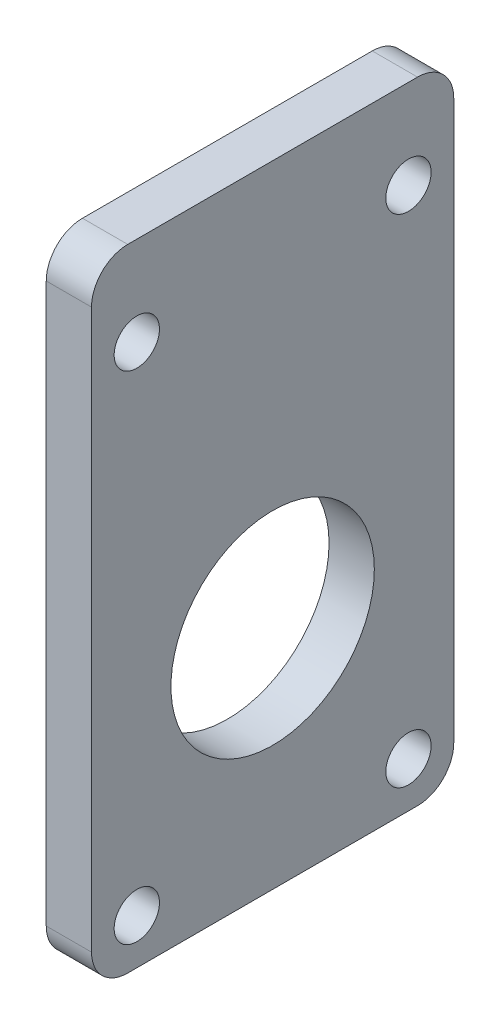
ISO-10303-21;
HEADER;
FILE_DESCRIPTION(('STEP AP214'),'2;1');
FILE_NAME('part.step','',(''),(''),'','','');
FILE_SCHEMA(('AUTOMOTIVE_DESIGN { 1 0 10303 214 1 1 1 1 }'));
ENDSEC;
DATA;
#1=APPLICATION_CONTEXT('core data for automotive mechanical design processes');
#2=APPLICATION_PROTOCOL_DEFINITION('international standard','automotive_design',2000,#1);
#3=PRODUCT_CONTEXT('',#1,'mechanical');
#4=PRODUCT('Part','Part','',(#3));
#5=PRODUCT_RELATED_PRODUCT_CATEGORY('part','',(#4));
#6=PRODUCT_DEFINITION_FORMATION('','',#4);
#7=PRODUCT_DEFINITION_CONTEXT('part definition',#1,'design');
#8=PRODUCT_DEFINITION('design','',#6,#7);
#9=PRODUCT_DEFINITION_SHAPE('','',#8);
#10=(LENGTH_UNIT() NAMED_UNIT(*) SI_UNIT(.MILLI.,.METRE.));
#11=(NAMED_UNIT(*) PLANE_ANGLE_UNIT() SI_UNIT($,.RADIAN.));
#12=(NAMED_UNIT(*) SI_UNIT($,.STERADIAN.) SOLID_ANGLE_UNIT());
#13=UNCERTAINTY_MEASURE_WITH_UNIT(LENGTH_MEASURE(1.E-05),#10,'distance_accuracy_value','');
#14=(GEOMETRIC_REPRESENTATION_CONTEXT(3) GLOBAL_UNCERTAINTY_ASSIGNED_CONTEXT((#13)) GLOBAL_UNIT_ASSIGNED_CONTEXT((#10,
#11,#12)) REPRESENTATION_CONTEXT('',''));
#15=CARTESIAN_POINT('',(0.,0.,0.));
#16=DIRECTION('',(0.,0.,1.));
#17=DIRECTION('',(1.,0.,0.));
#18=AXIS2_PLACEMENT_3D('',#15,#16,#17);
#19=CARTESIAN_POINT('',(3.175,0.,0.));
#20=DIRECTION('',(-1.,0.,0.));
#21=DIRECTION('',(0.,0.,1.));
#22=AXIS2_PLACEMENT_3D('',#19,#20,#21);
#23=PLANE('',#22);
#24=CARTESIAN_POINT('',(3.175,-37.900000019,19.05));
#25=DIRECTION('',(1.,0.,0.));
#26=DIRECTION('',(0.,0.,-1.));
#27=AXIS2_PLACEMENT_3D('',#24,#25,#26);
#28=CIRCLE('',#27,3.17499999999998);
#29=CARTESIAN_POINT('',(3.175,-37.900000019,15.875));
#30=VERTEX_POINT('',#29);
#31=EDGE_CURVE('E260',#30,#30,#28,.T.);
#32=ORIENTED_EDGE('',*,*,#31,.F.);
#33=EDGE_LOOP('',(#32));
#34=FACE_BOUND('',#33,.T.);
#35=CARTESIAN_POINT('',(3.175,-37.900000019,-19.05));
#36=DIRECTION('',(1.,0.,0.));
#37=DIRECTION('',(0.,0.,-1.));
#38=AXIS2_PLACEMENT_3D('',#35,#36,#37);
#39=CIRCLE('',#38,3.17499999999998);
#40=CARTESIAN_POINT('',(3.175,-37.900000019,-22.225));
#41=VERTEX_POINT('',#40);
#42=EDGE_CURVE('E252',#41,#41,#39,.T.);
#43=ORIENTED_EDGE('',*,*,#42,.F.);
#44=EDGE_LOOP('',(#43));
#45=FACE_BOUND('',#44,.T.);
#46=CARTESIAN_POINT('',(3.175,31.750000019,19.05));
#47=DIRECTION('',(1.,0.,0.));
#48=DIRECTION('',(0.,0.,-1.));
#49=AXIS2_PLACEMENT_3D('',#46,#47,#48);
#50=CIRCLE('',#49,3.17499999999998);
#51=CARTESIAN_POINT('',(3.175,31.750000019,15.875));
#52=VERTEX_POINT('',#51);
#53=EDGE_CURVE('E244',#52,#52,#50,.T.);
#54=ORIENTED_EDGE('',*,*,#53,.F.);
#55=EDGE_LOOP('',(#54));
#56=FACE_BOUND('',#55,.T.);
#57=CARTESIAN_POINT('',(3.175,31.750000019,-19.05));
#58=DIRECTION('',(1.,0.,0.));
#59=DIRECTION('',(0.,0.,-1.));
#60=AXIS2_PLACEMENT_3D('',#57,#58,#59);
#61=CIRCLE('',#60,3.17499999999998);
#62=CARTESIAN_POINT('',(3.175,31.750000019,-22.225));
#63=VERTEX_POINT('',#62);
#64=EDGE_CURVE('E236',#63,#63,#61,.T.);
#65=ORIENTED_EDGE('',*,*,#64,.F.);
#66=EDGE_LOOP('',(#65));
#67=FACE_BOUND('',#66,.T.);
#68=DIRECTION('',(0.,0.,-1.));
#69=VECTOR('',#68,1.);
#70=CARTESIAN_POINT('',(3.175,-44.250000019,25.4));
#71=LINE('',#70,#69);
#72=CARTESIAN_POINT('',(3.175,-44.250000019,20.32));
#73=VERTEX_POINT('',#72);
#74=CARTESIAN_POINT('',(3.175,-44.250000019,-20.32));
#75=VERTEX_POINT('',#74);
#76=EDGE_CURVE('E157',#73,#75,#71,.T.);
#77=ORIENTED_EDGE('',*,*,#76,.T.);
#78=CARTESIAN_POINT('',(3.175,-39.170000019,-20.32));
#79=DIRECTION('',(-1.,0.,0.));
#80=DIRECTION('',(0.,0.,1.));
#81=AXIS2_PLACEMENT_3D('',#78,#79,#80);
#82=CIRCLE('',#81,5.08);
#83=CARTESIAN_POINT('',(3.175,-39.170000019,-25.4));
#84=VERTEX_POINT('',#83);
#85=EDGE_CURVE('E186',#75,#84,#82,.F.);
#86=ORIENTED_EDGE('',*,*,#85,.T.);
#87=DIRECTION('',(0.,1.,0.));
#88=VECTOR('',#87,1.);
#89=CARTESIAN_POINT('',(3.175,-44.250000019,-25.4));
#90=LINE('',#89,#88);
#91=CARTESIAN_POINT('',(3.175,39.170000019,-25.4));
#92=VERTEX_POINT('',#91);
#93=EDGE_CURVE('E133',#84,#92,#90,.T.);
#94=ORIENTED_EDGE('',*,*,#93,.T.);
#95=CARTESIAN_POINT('',(3.175,39.170000019,-20.32));
#96=DIRECTION('',(-1.,0.,0.));
#97=DIRECTION('',(0.,0.,1.));
#98=AXIS2_PLACEMENT_3D('',#95,#96,#97);
#99=CIRCLE('',#98,5.08);
#100=CARTESIAN_POINT('',(3.175,44.250000019,-20.32));
#101=VERTEX_POINT('',#100);
#102=EDGE_CURVE('E180',#92,#101,#99,.F.);
#103=ORIENTED_EDGE('',*,*,#102,.T.);
#104=DIRECTION('',(0.,0.,1.));
#105=VECTOR('',#104,1.);
#106=CARTESIAN_POINT('',(3.175,44.250000019,25.4));
#107=LINE('',#106,#105);
#108=CARTESIAN_POINT('',(3.175,44.250000019,20.32));
#109=VERTEX_POINT('',#108);
#110=EDGE_CURVE('E201',#101,#109,#107,.T.);
#111=ORIENTED_EDGE('',*,*,#110,.T.);
#112=CARTESIAN_POINT('',(3.175,39.170000019,20.32));
#113=DIRECTION('',(-1.,0.,0.));
#114=DIRECTION('',(0.,0.,1.));
#115=AXIS2_PLACEMENT_3D('',#112,#113,#114);
#116=CIRCLE('',#115,5.08);
#117=CARTESIAN_POINT('',(3.175,39.170000019,25.4));
#118=VERTEX_POINT('',#117);
#119=EDGE_CURVE('E67',#109,#118,#116,.F.);
#120=ORIENTED_EDGE('',*,*,#119,.T.);
#121=DIRECTION('',(0.,-1.,0.));
#122=VECTOR('',#121,1.);
#123=CARTESIAN_POINT('',(3.175,-44.250000019,25.4));
#124=LINE('',#123,#122);
#125=CARTESIAN_POINT('',(3.175,-39.170000019,25.4));
#126=VERTEX_POINT('',#125);
#127=EDGE_CURVE('E208',#118,#126,#124,.T.);
#128=ORIENTED_EDGE('',*,*,#127,.T.);
#129=CARTESIAN_POINT('',(3.175,-39.170000019,20.32));
#130=DIRECTION('',(-1.,0.,0.));
#131=DIRECTION('',(0.,0.,1.));
#132=AXIS2_PLACEMENT_3D('',#129,#130,#131);
#133=CIRCLE('',#132,5.08);
#134=EDGE_CURVE('E183',#126,#73,#133,.F.);
#135=ORIENTED_EDGE('',*,*,#134,.T.);
#136=EDGE_LOOP('',(#77,#86,#94,#103,#111,#120,#128,#135));
#137=FACE_BOUND('',#136,.T.);
#138=CARTESIAN_POINT('',(3.175,-12.500000019,0.));
#139=DIRECTION('',(1.,0.,0.));
#140=DIRECTION('',(0.,0.,-1.));
#141=AXIS2_PLACEMENT_3D('',#138,#139,#140);
#142=CIRCLE('',#141,14.2621);
#143=CARTESIAN_POINT('',(3.175,-12.500000019,-14.2621));
#144=VERTEX_POINT('',#143);
#145=EDGE_CURVE('E144',#144,#144,#142,.T.);
#146=ORIENTED_EDGE('',*,*,#145,.F.);
#147=EDGE_LOOP('',(#146));
#148=FACE_BOUND('',#147,.T.);
#149=ADVANCED_FACE('F44',(#34,#45,#56,#67,#137,#148),#23,.F.);
#150=CARTESIAN_POINT('',(-3.175,0.,0.));
#151=DIRECTION('',(-1.,0.,0.));
#152=DIRECTION('',(0.,0.,1.));
#153=AXIS2_PLACEMENT_3D('',#150,#151,#152);
#154=PLANE('',#153);
#155=CARTESIAN_POINT('',(-3.17499999999999,-37.900000019,19.05));
#156=DIRECTION('',(1.,0.,0.));
#157=DIRECTION('',(0.,0.,-1.));
#158=AXIS2_PLACEMENT_3D('',#155,#156,#157);
#159=CIRCLE('',#158,3.17499999999998);
#160=CARTESIAN_POINT('',(-3.17499999999999,-37.900000019,15.875));
#161=VERTEX_POINT('',#160);
#162=EDGE_CURVE('E256',#161,#161,#159,.T.);
#163=ORIENTED_EDGE('',*,*,#162,.T.);
#164=EDGE_LOOP('',(#163));
#165=FACE_BOUND('',#164,.T.);
#166=CARTESIAN_POINT('',(-3.17499999999999,-37.900000019,-19.05));
#167=DIRECTION('',(1.,0.,0.));
#168=DIRECTION('',(0.,0.,-1.));
#169=AXIS2_PLACEMENT_3D('',#166,#167,#168);
#170=CIRCLE('',#169,3.17499999999998);
#171=CARTESIAN_POINT('',(-3.17499999999999,-37.900000019,-22.225));
#172=VERTEX_POINT('',#171);
#173=EDGE_CURVE('E248',#172,#172,#170,.T.);
#174=ORIENTED_EDGE('',*,*,#173,.T.);
#175=EDGE_LOOP('',(#174));
#176=FACE_BOUND('',#175,.T.);
#177=CARTESIAN_POINT('',(-3.17499999999999,31.750000019,19.05));
#178=DIRECTION('',(1.,0.,0.));
#179=DIRECTION('',(0.,0.,-1.));
#180=AXIS2_PLACEMENT_3D('',#177,#178,#179);
#181=CIRCLE('',#180,3.17499999999998);
#182=CARTESIAN_POINT('',(-3.17499999999999,31.750000019,15.875));
#183=VERTEX_POINT('',#182);
#184=EDGE_CURVE('E240',#183,#183,#181,.T.);
#185=ORIENTED_EDGE('',*,*,#184,.T.);
#186=EDGE_LOOP('',(#185));
#187=FACE_BOUND('',#186,.T.);
#188=CARTESIAN_POINT('',(-3.17499999999999,31.750000019,-19.05));
#189=DIRECTION('',(1.,0.,0.));
#190=DIRECTION('',(0.,0.,-1.));
#191=AXIS2_PLACEMENT_3D('',#188,#189,#190);
#192=CIRCLE('',#191,3.17499999999998);
#193=CARTESIAN_POINT('',(-3.17499999999999,31.750000019,-22.225));
#194=VERTEX_POINT('',#193);
#195=EDGE_CURVE('E231',#194,#194,#192,.T.);
#196=ORIENTED_EDGE('',*,*,#195,.T.);
#197=EDGE_LOOP('',(#196));
#198=FACE_BOUND('',#197,.T.);
#199=DIRECTION('',(0.,1.,0.));
#200=VECTOR('',#199,1.);
#201=CARTESIAN_POINT('',(-3.175,-44.250000019,-25.4));
#202=LINE('',#201,#200);
#203=CARTESIAN_POINT('',(-3.175,-39.170000019,-25.4));
#204=VERTEX_POINT('',#203);
#205=CARTESIAN_POINT('',(-3.175,39.170000019,-25.4));
#206=VERTEX_POINT('',#205);
#207=EDGE_CURVE('E130',#204,#206,#202,.T.);
#208=ORIENTED_EDGE('',*,*,#207,.F.);
#209=CARTESIAN_POINT('',(-3.175,-39.170000019,-20.32));
#210=DIRECTION('',(-1.,0.,0.));
#211=DIRECTION('',(0.,0.,1.));
#212=AXIS2_PLACEMENT_3D('',#209,#210,#211);
#213=CIRCLE('',#212,5.08);
#214=CARTESIAN_POINT('',(-3.175,-44.250000019,-20.32));
#215=VERTEX_POINT('',#214);
#216=EDGE_CURVE('E112',#204,#215,#213,.T.);
#217=ORIENTED_EDGE('',*,*,#216,.T.);
#218=DIRECTION('',(0.,0.,-1.));
#219=VECTOR('',#218,1.);
#220=CARTESIAN_POINT('',(-3.175,-44.250000019,25.4));
#221=LINE('',#220,#219);
#222=CARTESIAN_POINT('',(-3.175,-44.250000019,20.32));
#223=VERTEX_POINT('',#222);
#224=EDGE_CURVE('E162',#223,#215,#221,.T.);
#225=ORIENTED_EDGE('',*,*,#224,.F.);
#226=CARTESIAN_POINT('',(-3.175,-39.170000019,20.32));
#227=DIRECTION('',(-1.,0.,0.));
#228=DIRECTION('',(0.,0.,1.));
#229=AXIS2_PLACEMENT_3D('',#226,#227,#228);
#230=CIRCLE('',#229,5.08);
#231=CARTESIAN_POINT('',(-3.175,-39.170000019,25.4));
#232=VERTEX_POINT('',#231);
#233=EDGE_CURVE('E124',#223,#232,#230,.T.);
#234=ORIENTED_EDGE('',*,*,#233,.T.);
#235=DIRECTION('',(0.,-1.,0.));
#236=VECTOR('',#235,1.);
#237=CARTESIAN_POINT('',(-3.175,-44.250000019,25.4));
#238=LINE('',#237,#236);
#239=CARTESIAN_POINT('',(-3.175,39.170000019,25.4));
#240=VERTEX_POINT('',#239);
#241=EDGE_CURVE('E151',#240,#232,#238,.T.);
#242=ORIENTED_EDGE('',*,*,#241,.F.);
#243=CARTESIAN_POINT('',(-3.175,39.170000019,20.32));
#244=DIRECTION('',(-1.,0.,0.));
#245=DIRECTION('',(0.,0.,1.));
#246=AXIS2_PLACEMENT_3D('',#243,#244,#245);
#247=CIRCLE('',#246,5.08);
#248=CARTESIAN_POINT('',(-3.175,44.250000019,20.32));
#249=VERTEX_POINT('',#248);
#250=EDGE_CURVE('E135',#240,#249,#247,.T.);
#251=ORIENTED_EDGE('',*,*,#250,.T.);
#252=DIRECTION('',(0.,0.,1.));
#253=VECTOR('',#252,1.);
#254=CARTESIAN_POINT('',(-3.175,44.250000019,25.4));
#255=LINE('',#254,#253);
#256=CARTESIAN_POINT('',(-3.175,44.250000019,-20.32));
#257=VERTEX_POINT('',#256);
#258=EDGE_CURVE('E143',#257,#249,#255,.T.);
#259=ORIENTED_EDGE('',*,*,#258,.F.);
#260=CARTESIAN_POINT('',(-3.175,39.170000019,-20.32));
#261=DIRECTION('',(-1.,0.,0.));
#262=DIRECTION('',(0.,0.,1.));
#263=AXIS2_PLACEMENT_3D('',#260,#261,#262);
#264=CIRCLE('',#263,5.08);
#265=EDGE_CURVE('E141',#257,#206,#264,.T.);
#266=ORIENTED_EDGE('',*,*,#265,.T.);
#267=EDGE_LOOP('',(#208,#217,#225,#234,#242,#251,#259,#266));
#268=FACE_BOUND('',#267,.T.);
#269=CARTESIAN_POINT('',(-3.175,-12.500000019,0.));
#270=DIRECTION('',(1.,0.,0.));
#271=DIRECTION('',(0.,0.,-1.));
#272=AXIS2_PLACEMENT_3D('',#269,#270,#271);
#273=CIRCLE('',#272,14.2621);
#274=CARTESIAN_POINT('',(-3.175,-12.500000019,-14.2621));
#275=VERTEX_POINT('',#274);
#276=EDGE_CURVE('E154',#275,#275,#273,.T.);
#277=ORIENTED_EDGE('',*,*,#276,.T.);
#278=EDGE_LOOP('',(#277));
#279=FACE_BOUND('',#278,.T.);
#280=ADVANCED_FACE('F138',(#165,#176,#187,#198,#268,#279),#154,.T.);
#281=CARTESIAN_POINT('',(3.175,-44.250000019,-25.4));
#282=DIRECTION('',(0.,0.,1.));
#283=DIRECTION('',(1.,0.,0.));
#284=AXIS2_PLACEMENT_3D('',#281,#282,#283);
#285=PLANE('',#284);
#286=ORIENTED_EDGE('',*,*,#93,.F.);
#287=DIRECTION('',(-1.,0.,0.));
#288=VECTOR('',#287,1.);
#289=CARTESIAN_POINT('',(3.175,-39.170000019,-25.4));
#290=LINE('',#289,#288);
#291=EDGE_CURVE('E116',#84,#204,#290,.T.);
#292=ORIENTED_EDGE('',*,*,#291,.T.);
#293=ORIENTED_EDGE('',*,*,#207,.T.);
#294=DIRECTION('',(-1.,0.,0.));
#295=VECTOR('',#294,1.);
#296=CARTESIAN_POINT('',(3.175,39.170000019,-25.4));
#297=LINE('',#296,#295);
#298=EDGE_CURVE('E136',#206,#92,#297,.F.);
#299=ORIENTED_EDGE('',*,*,#298,.T.);
#300=EDGE_LOOP('',(#286,#292,#293,#299));
#301=FACE_BOUND('',#300,.T.);
#302=ADVANCED_FACE('F129',(#301),#285,.F.);
#303=CARTESIAN_POINT('',(3.175,44.250000019,25.4));
#304=DIRECTION('',(0.,-1.,0.));
#305=DIRECTION('',(0.,0.,-1.));
#306=AXIS2_PLACEMENT_3D('',#303,#304,#305);
#307=PLANE('',#306);
#308=ORIENTED_EDGE('',*,*,#110,.F.);
#309=DIRECTION('',(-1.,0.,0.));
#310=VECTOR('',#309,1.);
#311=CARTESIAN_POINT('',(3.175,44.250000019,-20.32));
#312=LINE('',#311,#310);
#313=EDGE_CURVE('E11',#101,#257,#312,.T.);
#314=ORIENTED_EDGE('',*,*,#313,.T.);
#315=ORIENTED_EDGE('',*,*,#258,.T.);
#316=DIRECTION('',(-1.,0.,0.));
#317=VECTOR('',#316,1.);
#318=CARTESIAN_POINT('',(3.175,44.250000019,20.32));
#319=LINE('',#318,#317);
#320=EDGE_CURVE('E53',#249,#109,#319,.F.);
#321=ORIENTED_EDGE('',*,*,#320,.T.);
#322=EDGE_LOOP('',(#308,#314,#315,#321));
#323=FACE_BOUND('',#322,.T.);
#324=ADVANCED_FACE('F200',(#323),#307,.F.);
#325=CARTESIAN_POINT('',(3.175,-44.250000019,25.4));
#326=DIRECTION('',(0.,0.,-1.));
#327=DIRECTION('',(-1.,0.,0.));
#328=AXIS2_PLACEMENT_3D('',#325,#326,#327);
#329=PLANE('',#328);
#330=ORIENTED_EDGE('',*,*,#241,.T.);
#331=DIRECTION('',(-1.,0.,0.));
#332=VECTOR('',#331,1.);
#333=CARTESIAN_POINT('',(3.175,-39.170000019,25.4));
#334=LINE('',#333,#332);
#335=EDGE_CURVE('E60',#232,#126,#334,.F.);
#336=ORIENTED_EDGE('',*,*,#335,.T.);
#337=ORIENTED_EDGE('',*,*,#127,.F.);
#338=DIRECTION('',(-1.,0.,0.));
#339=VECTOR('',#338,1.);
#340=CARTESIAN_POINT('',(3.175,39.170000019,25.4));
#341=LINE('',#340,#339);
#342=EDGE_CURVE('E189',#118,#240,#341,.T.);
#343=ORIENTED_EDGE('',*,*,#342,.T.);
#344=EDGE_LOOP('',(#330,#336,#337,#343));
#345=FACE_BOUND('',#344,.T.);
#346=ADVANCED_FACE('F212',(#345),#329,.F.);
#347=CARTESIAN_POINT('',(3.175,-44.250000019,25.4));
#348=DIRECTION('',(0.,1.,0.));
#349=DIRECTION('',(0.,0.,1.));
#350=AXIS2_PLACEMENT_3D('',#347,#348,#349);
#351=PLANE('',#350);
#352=ORIENTED_EDGE('',*,*,#224,.T.);
#353=DIRECTION('',(-1.,0.,0.));
#354=VECTOR('',#353,1.);
#355=CARTESIAN_POINT('',(3.175,-44.250000019,-20.32));
#356=LINE('',#355,#354);
#357=EDGE_CURVE('E117',#215,#75,#356,.F.);
#358=ORIENTED_EDGE('',*,*,#357,.T.);
#359=ORIENTED_EDGE('',*,*,#76,.F.);
#360=DIRECTION('',(-1.,0.,0.));
#361=VECTOR('',#360,1.);
#362=CARTESIAN_POINT('',(3.175,-44.250000019,20.32));
#363=LINE('',#362,#361);
#364=EDGE_CURVE('E123',#73,#223,#363,.T.);
#365=ORIENTED_EDGE('',*,*,#364,.T.);
#366=EDGE_LOOP('',(#352,#358,#359,#365));
#367=FACE_BOUND('',#366,.T.);
#368=ADVANCED_FACE('F219',(#367),#351,.F.);
#369=CARTESIAN_POINT('',(3.175,-12.500000019,0.));
#370=DIRECTION('',(-1.,0.,0.));
#371=DIRECTION('',(0.,0.,1.));
#372=AXIS2_PLACEMENT_3D('',#369,#370,#371);
#373=CYLINDRICAL_SURFACE('',#372,14.2621);
#374=ORIENTED_EDGE('',*,*,#145,.T.);
#375=EDGE_LOOP('',(#374));
#376=FACE_BOUND('',#375,.T.);
#377=ORIENTED_EDGE('',*,*,#276,.F.);
#378=EDGE_LOOP('',(#377));
#379=FACE_BOUND('',#378,.T.);
#380=ADVANCED_FACE('F294',(#376,#379),#373,.F.);
#381=CARTESIAN_POINT('',(3.175,-39.170000019,-20.32));
#382=DIRECTION('',(-1.,0.,0.));
#383=DIRECTION('',(0.,0.,1.));
#384=AXIS2_PLACEMENT_3D('',#381,#382,#383);
#385=CYLINDRICAL_SURFACE('',#384,5.08);
#386=ORIENTED_EDGE('',*,*,#85,.F.);
#387=ORIENTED_EDGE('',*,*,#357,.F.);
#388=ORIENTED_EDGE('',*,*,#216,.F.);
#389=ORIENTED_EDGE('',*,*,#291,.F.);
#390=EDGE_LOOP('',(#386,#387,#388,#389));
#391=FACE_BOUND('',#390,.T.);
#392=ADVANCED_FACE('F115',(#391),#385,.T.);
#393=CARTESIAN_POINT('',(3.175,-39.170000019,20.32));
#394=DIRECTION('',(-1.,0.,0.));
#395=DIRECTION('',(0.,0.,1.));
#396=AXIS2_PLACEMENT_3D('',#393,#394,#395);
#397=CYLINDRICAL_SURFACE('',#396,5.08);
#398=ORIENTED_EDGE('',*,*,#134,.F.);
#399=ORIENTED_EDGE('',*,*,#335,.F.);
#400=ORIENTED_EDGE('',*,*,#233,.F.);
#401=ORIENTED_EDGE('',*,*,#364,.F.);
#402=EDGE_LOOP('',(#398,#399,#400,#401));
#403=FACE_BOUND('',#402,.T.);
#404=ADVANCED_FACE('F216',(#403),#397,.T.);
#405=CARTESIAN_POINT('',(3.175,39.170000019,-20.32));
#406=DIRECTION('',(-1.,0.,0.));
#407=DIRECTION('',(0.,0.,1.));
#408=AXIS2_PLACEMENT_3D('',#405,#406,#407);
#409=CYLINDRICAL_SURFACE('',#408,5.08);
#410=ORIENTED_EDGE('',*,*,#102,.F.);
#411=ORIENTED_EDGE('',*,*,#298,.F.);
#412=ORIENTED_EDGE('',*,*,#265,.F.);
#413=ORIENTED_EDGE('',*,*,#313,.F.);
#414=EDGE_LOOP('',(#410,#411,#412,#413));
#415=FACE_BOUND('',#414,.T.);
#416=ADVANCED_FACE('F290',(#415),#409,.T.);
#417=CARTESIAN_POINT('',(3.175,39.170000019,20.32));
#418=DIRECTION('',(-1.,0.,0.));
#419=DIRECTION('',(0.,0.,1.));
#420=AXIS2_PLACEMENT_3D('',#417,#418,#419);
#421=CYLINDRICAL_SURFACE('',#420,5.08);
#422=ORIENTED_EDGE('',*,*,#119,.F.);
#423=ORIENTED_EDGE('',*,*,#320,.F.);
#424=ORIENTED_EDGE('',*,*,#250,.F.);
#425=ORIENTED_EDGE('',*,*,#342,.F.);
#426=EDGE_LOOP('',(#422,#423,#424,#425));
#427=FACE_BOUND('',#426,.T.);
#428=ADVANCED_FACE('F46',(#427),#421,.T.);
#429=CARTESIAN_POINT('',(3.175,31.750000019,-19.05));
#430=DIRECTION('',(1.,0.,0.));
#431=DIRECTION('',(0.,0.,-1.));
#432=AXIS2_PLACEMENT_3D('',#429,#430,#431);
#433=CYLINDRICAL_SURFACE('',#432,3.17499999999998);
#434=ORIENTED_EDGE('',*,*,#195,.F.);
#435=EDGE_LOOP('',(#434));
#436=FACE_BOUND('',#435,.T.);
#437=ORIENTED_EDGE('',*,*,#64,.T.);
#438=EDGE_LOOP('',(#437));
#439=FACE_BOUND('',#438,.T.);
#440=ADVANCED_FACE('F278',(#436,#439),#433,.F.);
#441=CARTESIAN_POINT('',(3.175,31.750000019,19.05));
#442=DIRECTION('',(1.,0.,0.));
#443=DIRECTION('',(0.,0.,-1.));
#444=AXIS2_PLACEMENT_3D('',#441,#442,#443);
#445=CYLINDRICAL_SURFACE('',#444,3.17499999999998);
#446=ORIENTED_EDGE('',*,*,#184,.F.);
#447=EDGE_LOOP('',(#446));
#448=FACE_BOUND('',#447,.T.);
#449=ORIENTED_EDGE('',*,*,#53,.T.);
#450=EDGE_LOOP('',(#449));
#451=FACE_BOUND('',#450,.T.);
#452=ADVANCED_FACE('F280',(#448,#451),#445,.F.);
#453=CARTESIAN_POINT('',(3.175,-37.900000019,-19.05));
#454=DIRECTION('',(1.,0.,0.));
#455=DIRECTION('',(0.,0.,-1.));
#456=AXIS2_PLACEMENT_3D('',#453,#454,#455);
#457=CYLINDRICAL_SURFACE('',#456,3.17499999999998);
#458=ORIENTED_EDGE('',*,*,#173,.F.);
#459=EDGE_LOOP('',(#458));
#460=FACE_BOUND('',#459,.T.);
#461=ORIENTED_EDGE('',*,*,#42,.T.);
#462=EDGE_LOOP('',(#461));
#463=FACE_BOUND('',#462,.T.);
#464=ADVANCED_FACE('F287',(#460,#463),#457,.F.);
#465=CARTESIAN_POINT('',(3.175,-37.900000019,19.05));
#466=DIRECTION('',(1.,0.,0.));
#467=DIRECTION('',(0.,0.,-1.));
#468=AXIS2_PLACEMENT_3D('',#465,#466,#467);
#469=CYLINDRICAL_SURFACE('',#468,3.17499999999998);
#470=ORIENTED_EDGE('',*,*,#162,.F.);
#471=EDGE_LOOP('',(#470));
#472=FACE_BOUND('',#471,.T.);
#473=ORIENTED_EDGE('',*,*,#31,.T.);
#474=EDGE_LOOP('',(#473));
#475=FACE_BOUND('',#474,.T.);
#476=ADVANCED_FACE('F267',(#472,#475),#469,.F.);
#477=CLOSED_SHELL('',(#149,#280,#302,#324,#346,#368,#380,#392,#404,#416,#428,#440,#452,#464,#476));
#478=MANIFOLD_SOLID_BREP('B2',#477);
#479=ADVANCED_BREP_SHAPE_REPRESENTATION('',(#18,#478),#14);
#480=SHAPE_DEFINITION_REPRESENTATION(#9,#479);
ENDSEC;
END-ISO-10303-21;
